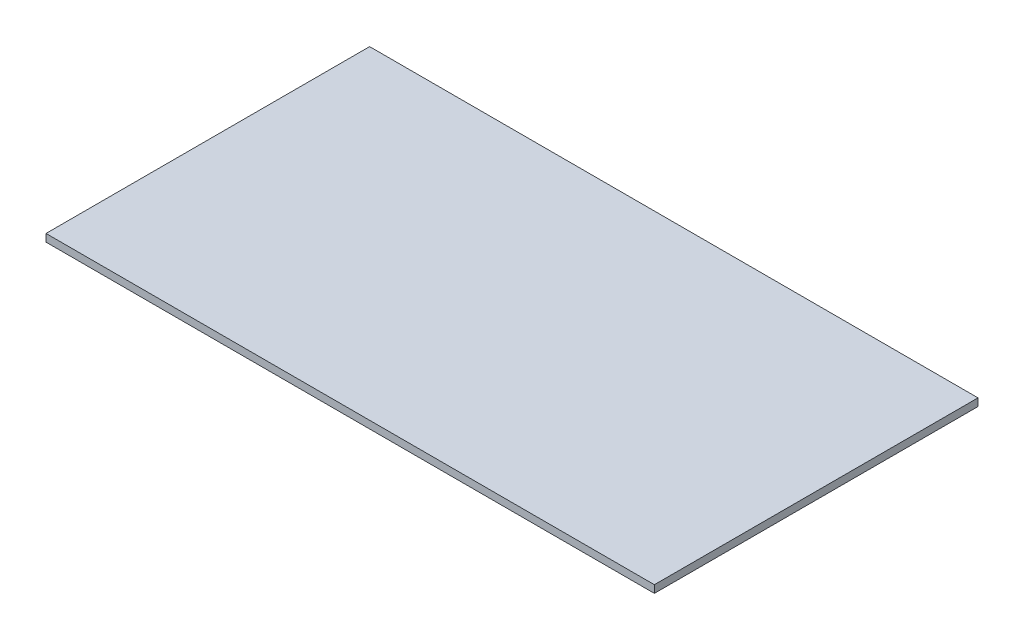
ISO-10303-21;
HEADER;
FILE_DESCRIPTION(('STEP AP214'),'2;1');
FILE_NAME('part.step','',(''),(''),'','','');
FILE_SCHEMA(('AUTOMOTIVE_DESIGN { 1 0 10303 214 1 1 1 1 }'));
ENDSEC;
DATA;
#1=APPLICATION_CONTEXT('core data for automotive mechanical design processes');
#2=APPLICATION_PROTOCOL_DEFINITION('international standard','automotive_design',2000,#1);
#3=PRODUCT_CONTEXT('',#1,'mechanical');
#4=PRODUCT('Part','Part','',(#3));
#5=PRODUCT_RELATED_PRODUCT_CATEGORY('part','',(#4));
#6=PRODUCT_DEFINITION_FORMATION('','',#4);
#7=PRODUCT_DEFINITION_CONTEXT('part definition',#1,'design');
#8=PRODUCT_DEFINITION('design','',#6,#7);
#9=PRODUCT_DEFINITION_SHAPE('','',#8);
#10=(LENGTH_UNIT() NAMED_UNIT(*) SI_UNIT(.MILLI.,.METRE.));
#11=(NAMED_UNIT(*) PLANE_ANGLE_UNIT() SI_UNIT($,.RADIAN.));
#12=(NAMED_UNIT(*) SI_UNIT($,.STERADIAN.) SOLID_ANGLE_UNIT());
#13=UNCERTAINTY_MEASURE_WITH_UNIT(LENGTH_MEASURE(1.E-05),#10,'distance_accuracy_value','');
#14=(GEOMETRIC_REPRESENTATION_CONTEXT(3) GLOBAL_UNCERTAINTY_ASSIGNED_CONTEXT((#13)) GLOBAL_UNIT_ASSIGNED_CONTEXT((#10,
#11,#12)) REPRESENTATION_CONTEXT('',''));
#15=CARTESIAN_POINT('',(0.,0.,0.));
#16=DIRECTION('',(0.,0.,1.));
#17=DIRECTION('',(1.,0.,0.));
#18=AXIS2_PLACEMENT_3D('',#15,#16,#17);
#19=CARTESIAN_POINT('',(63.5,1.5748,33.7765957446808));
#20=DIRECTION('',(-1.,0.,0.));
#21=DIRECTION('',(0.,0.,1.));
#22=AXIS2_PLACEMENT_3D('',#19,#20,#21);
#23=PLANE('',#22);
#24=DIRECTION('',(0.,0.,-1.));
#25=VECTOR('',#24,1.);
#26=CARTESIAN_POINT('',(63.5,0.,33.7765957446808));
#27=LINE('',#26,#25);
#28=CARTESIAN_POINT('',(63.5,0.,33.7765957446808));
#29=VERTEX_POINT('',#28);
#30=CARTESIAN_POINT('',(63.5,0.,-33.7765957446808));
#31=VERTEX_POINT('',#30);
#32=EDGE_CURVE('E96',#29,#31,#27,.T.);
#33=ORIENTED_EDGE('',*,*,#32,.T.);
#34=DIRECTION('',(0.,-1.,0.));
#35=VECTOR('',#34,1.);
#36=CARTESIAN_POINT('',(63.5,1.5748,-33.7765957446808));
#37=LINE('',#36,#35);
#38=CARTESIAN_POINT('',(63.5,1.5748,-33.7765957446808));
#39=VERTEX_POINT('',#38);
#40=EDGE_CURVE('E11',#39,#31,#37,.T.);
#41=ORIENTED_EDGE('',*,*,#40,.F.);
#42=DIRECTION('',(0.,0.,-1.));
#43=VECTOR('',#42,1.);
#44=CARTESIAN_POINT('',(63.5,1.5748,33.7765957446808));
#45=LINE('',#44,#43);
#46=CARTESIAN_POINT('',(63.5,1.5748,33.7765957446808));
#47=VERTEX_POINT('',#46);
#48=EDGE_CURVE('E84',#47,#39,#45,.T.);
#49=ORIENTED_EDGE('',*,*,#48,.F.);
#50=DIRECTION('',(0.,-1.,0.));
#51=VECTOR('',#50,1.);
#52=CARTESIAN_POINT('',(63.5,1.5748,33.7765957446808));
#53=LINE('',#52,#51);
#54=EDGE_CURVE('E92',#47,#29,#53,.T.);
#55=ORIENTED_EDGE('',*,*,#54,.T.);
#56=EDGE_LOOP('',(#33,#41,#49,#55));
#57=FACE_BOUND('',#56,.T.);
#58=ADVANCED_FACE('F33',(#57),#23,.F.);
#59=CARTESIAN_POINT('',(-63.5,1.5748,-33.7765957446808));
#60=DIRECTION('',(0.,0.,1.));
#61=DIRECTION('',(1.,0.,0.));
#62=AXIS2_PLACEMENT_3D('',#59,#60,#61);
#63=PLANE('',#62);
#64=DIRECTION('',(-1.,0.,0.));
#65=VECTOR('',#64,1.);
#66=CARTESIAN_POINT('',(-63.5,0.,-33.7765957446808));
#67=LINE('',#66,#65);
#68=CARTESIAN_POINT('',(-63.5,0.,-33.7765957446808));
#69=VERTEX_POINT('',#68);
#70=EDGE_CURVE('E88',#31,#69,#67,.T.);
#71=ORIENTED_EDGE('',*,*,#70,.T.);
#72=DIRECTION('',(0.,-1.,0.));
#73=VECTOR('',#72,1.);
#74=CARTESIAN_POINT('',(-63.5,1.5748,-33.7765957446808));
#75=LINE('',#74,#73);
#76=CARTESIAN_POINT('',(-63.5,1.5748,-33.7765957446808));
#77=VERTEX_POINT('',#76);
#78=EDGE_CURVE('E41',#77,#69,#75,.T.);
#79=ORIENTED_EDGE('',*,*,#78,.F.);
#80=DIRECTION('',(-1.,0.,0.));
#81=VECTOR('',#80,1.);
#82=CARTESIAN_POINT('',(-63.5,1.5748,-33.7765957446808));
#83=LINE('',#82,#81);
#84=EDGE_CURVE('E79',#39,#77,#83,.T.);
#85=ORIENTED_EDGE('',*,*,#84,.F.);
#86=ORIENTED_EDGE('',*,*,#40,.T.);
#87=EDGE_LOOP('',(#71,#79,#85,#86));
#88=FACE_BOUND('',#87,.T.);
#89=ADVANCED_FACE('F87',(#88),#63,.F.);
#90=CARTESIAN_POINT('',(-63.5,1.5748,33.7765957446808));
#91=DIRECTION('',(1.,0.,0.));
#92=DIRECTION('',(0.,0.,-1.));
#93=AXIS2_PLACEMENT_3D('',#90,#91,#92);
#94=PLANE('',#93);
#95=DIRECTION('',(0.,0.,1.));
#96=VECTOR('',#95,1.);
#97=CARTESIAN_POINT('',(-63.5,0.,33.7765957446808));
#98=LINE('',#97,#96);
#99=CARTESIAN_POINT('',(-63.5,0.,33.7765957446808));
#100=VERTEX_POINT('',#99);
#101=EDGE_CURVE('E66',#69,#100,#98,.T.);
#102=ORIENTED_EDGE('',*,*,#101,.T.);
#103=DIRECTION('',(0.,-1.,0.));
#104=VECTOR('',#103,1.);
#105=CARTESIAN_POINT('',(-63.5,1.5748,33.7765957446808));
#106=LINE('',#105,#104);
#107=CARTESIAN_POINT('',(-63.5,1.5748,33.7765957446808));
#108=VERTEX_POINT('',#107);
#109=EDGE_CURVE('E89',#108,#100,#106,.T.);
#110=ORIENTED_EDGE('',*,*,#109,.F.);
#111=DIRECTION('',(0.,0.,1.));
#112=VECTOR('',#111,1.);
#113=CARTESIAN_POINT('',(-63.5,1.5748,33.7765957446808));
#114=LINE('',#113,#112);
#115=EDGE_CURVE('E82',#77,#108,#114,.T.);
#116=ORIENTED_EDGE('',*,*,#115,.F.);
#117=ORIENTED_EDGE('',*,*,#78,.T.);
#118=EDGE_LOOP('',(#102,#110,#116,#117));
#119=FACE_BOUND('',#118,.T.);
#120=ADVANCED_FACE('F90',(#119),#94,.F.);
#121=CARTESIAN_POINT('',(-63.5,1.5748,33.7765957446808));
#122=DIRECTION('',(0.,0.,-1.));
#123=DIRECTION('',(-1.,0.,0.));
#124=AXIS2_PLACEMENT_3D('',#121,#122,#123);
#125=PLANE('',#124);
#126=DIRECTION('',(1.,0.,0.));
#127=VECTOR('',#126,1.);
#128=CARTESIAN_POINT('',(-63.5,0.,33.7765957446808));
#129=LINE('',#128,#127);
#130=EDGE_CURVE('E72',#100,#29,#129,.T.);
#131=ORIENTED_EDGE('',*,*,#130,.T.);
#132=ORIENTED_EDGE('',*,*,#54,.F.);
#133=DIRECTION('',(1.,0.,0.));
#134=VECTOR('',#133,1.);
#135=CARTESIAN_POINT('',(-63.5,1.5748,33.7765957446808));
#136=LINE('',#135,#134);
#137=EDGE_CURVE('E49',#108,#47,#136,.T.);
#138=ORIENTED_EDGE('',*,*,#137,.F.);
#139=ORIENTED_EDGE('',*,*,#109,.T.);
#140=EDGE_LOOP('',(#131,#132,#138,#139));
#141=FACE_BOUND('',#140,.T.);
#142=ADVANCED_FACE('F103',(#141),#125,.F.);
#143=CARTESIAN_POINT('',(0.,1.5748,0.));
#144=DIRECTION('',(0.,-1.,0.));
#145=DIRECTION('',(0.,0.,-1.));
#146=AXIS2_PLACEMENT_3D('',#143,#144,#145);
#147=PLANE('',#146);
#148=ORIENTED_EDGE('',*,*,#48,.T.);
#149=ORIENTED_EDGE('',*,*,#84,.T.);
#150=ORIENTED_EDGE('',*,*,#115,.T.);
#151=ORIENTED_EDGE('',*,*,#137,.T.);
#152=EDGE_LOOP('',(#148,#149,#150,#151));
#153=FACE_BOUND('',#152,.T.);
#154=ADVANCED_FACE('F80',(#153),#147,.F.);
#155=CARTESIAN_POINT('',(0.,0.,0.));
#156=DIRECTION('',(0.,-1.,0.));
#157=DIRECTION('',(0.,0.,-1.));
#158=AXIS2_PLACEMENT_3D('',#155,#156,#157);
#159=PLANE('',#158);
#160=ORIENTED_EDGE('',*,*,#32,.F.);
#161=ORIENTED_EDGE('',*,*,#130,.F.);
#162=ORIENTED_EDGE('',*,*,#101,.F.);
#163=ORIENTED_EDGE('',*,*,#70,.F.);
#164=EDGE_LOOP('',(#160,#161,#162,#163));
#165=FACE_BOUND('',#164,.T.);
#166=ADVANCED_FACE('F106',(#165),#159,.T.);
#167=CLOSED_SHELL('',(#58,#89,#120,#142,#154,#166));
#168=MANIFOLD_SOLID_BREP('B2',#167);
#169=ADVANCED_BREP_SHAPE_REPRESENTATION('',(#18,#168),#14);
#170=SHAPE_DEFINITION_REPRESENTATION(#9,#169);
ENDSEC;
END-ISO-10303-21;
